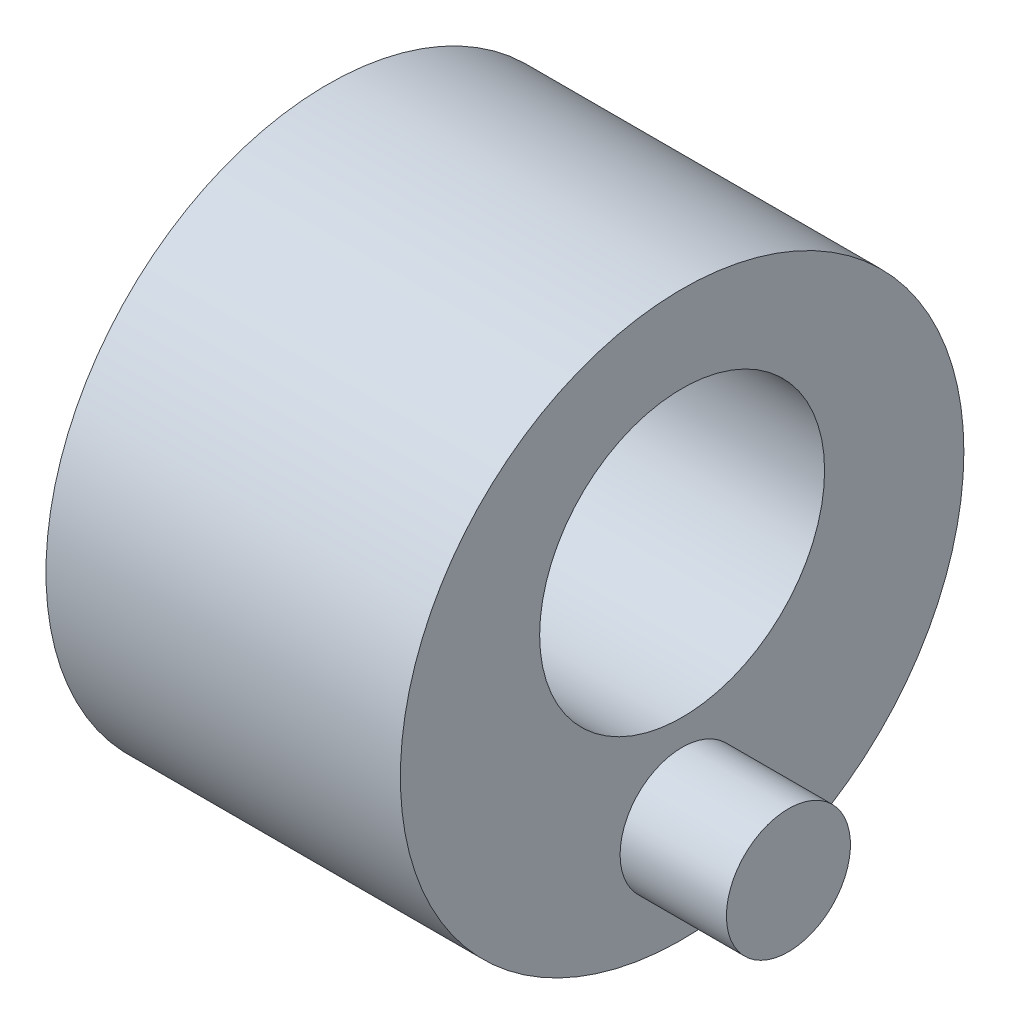
ISO-10303-21;
HEADER;
FILE_DESCRIPTION(('STEP AP214'),'2;1');
FILE_NAME('part.step','',(''),(''),'','','');
FILE_SCHEMA(('AUTOMOTIVE_DESIGN { 1 0 10303 214 1 1 1 1 }'));
ENDSEC;
DATA;
#1=APPLICATION_CONTEXT('core data for automotive mechanical design processes');
#2=APPLICATION_PROTOCOL_DEFINITION('international standard','automotive_design',2000,#1);
#3=PRODUCT_CONTEXT('',#1,'mechanical');
#4=PRODUCT('Part','Part','',(#3));
#5=PRODUCT_RELATED_PRODUCT_CATEGORY('part','',(#4));
#6=PRODUCT_DEFINITION_FORMATION('','',#4);
#7=PRODUCT_DEFINITION_CONTEXT('part definition',#1,'design');
#8=PRODUCT_DEFINITION('design','',#6,#7);
#9=PRODUCT_DEFINITION_SHAPE('','',#8);
#10=(LENGTH_UNIT() NAMED_UNIT(*) SI_UNIT(.MILLI.,.METRE.));
#11=(NAMED_UNIT(*) PLANE_ANGLE_UNIT() SI_UNIT($,.RADIAN.));
#12=(NAMED_UNIT(*) SI_UNIT($,.STERADIAN.) SOLID_ANGLE_UNIT());
#13=UNCERTAINTY_MEASURE_WITH_UNIT(LENGTH_MEASURE(1.E-05),#10,'distance_accuracy_value','');
#14=(GEOMETRIC_REPRESENTATION_CONTEXT(3) GLOBAL_UNCERTAINTY_ASSIGNED_CONTEXT((#13)) GLOBAL_UNIT_ASSIGNED_CONTEXT((#10,
#11,#12)) REPRESENTATION_CONTEXT('',''));
#15=CARTESIAN_POINT('',(0.,0.,0.));
#16=DIRECTION('',(0.,0.,1.));
#17=DIRECTION('',(1.,0.,0.));
#18=AXIS2_PLACEMENT_3D('',#15,#16,#17);
#19=CARTESIAN_POINT('',(-127.,0.,0.));
#20=DIRECTION('',(1.,0.,0.));
#21=DIRECTION('',(0.,0.,-1.));
#22=AXIS2_PLACEMENT_3D('',#19,#20,#21);
#23=CYLINDRICAL_SURFACE('',#22,100.965);
#24=CARTESIAN_POINT('',(-127.,0.,0.));
#25=DIRECTION('',(1.,0.,0.));
#26=DIRECTION('',(0.,0.,-1.));
#27=AXIS2_PLACEMENT_3D('',#24,#25,#26);
#28=CIRCLE('',#27,100.965);
#29=CARTESIAN_POINT('',(-127.,0.,-100.965));
#30=VERTEX_POINT('',#29);
#31=EDGE_CURVE('E10',#30,#30,#28,.T.);
#32=ORIENTED_EDGE('',*,*,#31,.T.);
#33=EDGE_LOOP('',(#32));
#34=FACE_BOUND('',#33,.T.);
#35=CARTESIAN_POINT('',(0.,0.,0.));
#36=DIRECTION('',(1.,0.,0.));
#37=DIRECTION('',(0.,0.,-1.));
#38=AXIS2_PLACEMENT_3D('',#35,#36,#37);
#39=CIRCLE('',#38,100.965);
#40=CARTESIAN_POINT('',(0.,0.,-100.965));
#41=VERTEX_POINT('',#40);
#42=EDGE_CURVE('E34',#41,#41,#39,.T.);
#43=ORIENTED_EDGE('',*,*,#42,.F.);
#44=EDGE_LOOP('',(#43));
#45=FACE_BOUND('',#44,.T.);
#46=ADVANCED_FACE('F31',(#34,#45),#23,.T.);
#47=CARTESIAN_POINT('',(-127.,0.,0.));
#48=DIRECTION('',(1.,0.,0.));
#49=DIRECTION('',(0.,0.,-1.));
#50=AXIS2_PLACEMENT_3D('',#47,#48,#49);
#51=PLANE('',#50);
#52=CARTESIAN_POINT('',(-127.,19.0499999999965,0.));
#53=DIRECTION('',(1.,0.,0.));
#54=DIRECTION('',(0.,0.,-1.));
#55=AXIS2_PLACEMENT_3D('',#52,#53,#54);
#56=CIRCLE('',#55,51.054);
#57=CARTESIAN_POINT('',(-127.,19.0499999999965,-51.054));
#58=VERTEX_POINT('',#57);
#59=EDGE_CURVE('E41',#58,#58,#56,.T.);
#60=ORIENTED_EDGE('',*,*,#59,.T.);
#61=EDGE_LOOP('',(#60));
#62=FACE_BOUND('',#61,.T.);
#63=ORIENTED_EDGE('',*,*,#31,.F.);
#64=EDGE_LOOP('',(#63));
#65=FACE_BOUND('',#64,.T.);
#66=ADVANCED_FACE('F67',(#62,#65),#51,.F.);
#67=CARTESIAN_POINT('',(0.,0.,0.));
#68=DIRECTION('',(1.,0.,0.));
#69=DIRECTION('',(0.,0.,-1.));
#70=AXIS2_PLACEMENT_3D('',#67,#68,#69);
#71=PLANE('',#70);
#72=CARTESIAN_POINT('',(0.,-63.5000000000024,-1.1085453250827E-13));
#73=DIRECTION('',(1.,0.,0.));
#74=DIRECTION('',(0.,0.,-1.));
#75=AXIS2_PLACEMENT_3D('',#72,#73,#74);
#76=CIRCLE('',#75,22.225);
#77=CARTESIAN_POINT('',(0.,-63.5000000000024,22.2249999999999));
#78=VERTEX_POINT('',#77);
#79=EDGE_CURVE('E49',#78,#78,#76,.T.);
#80=ORIENTED_EDGE('',*,*,#79,.F.);
#81=EDGE_LOOP('',(#80));
#82=FACE_BOUND('',#81,.T.);
#83=CARTESIAN_POINT('',(0.,19.0499999999965,0.));
#84=DIRECTION('',(1.,0.,0.));
#85=DIRECTION('',(0.,0.,-1.));
#86=AXIS2_PLACEMENT_3D('',#83,#84,#85);
#87=CIRCLE('',#86,51.054);
#88=CARTESIAN_POINT('',(0.,19.0499999999965,-51.054));
#89=VERTEX_POINT('',#88);
#90=EDGE_CURVE('E43',#89,#89,#87,.T.);
#91=ORIENTED_EDGE('',*,*,#90,.F.);
#92=EDGE_LOOP('',(#91));
#93=FACE_BOUND('',#92,.T.);
#94=ORIENTED_EDGE('',*,*,#42,.T.);
#95=EDGE_LOOP('',(#94));
#96=FACE_BOUND('',#95,.T.);
#97=ADVANCED_FACE('F64',(#82,#93,#96),#71,.T.);
#98=CARTESIAN_POINT('',(-127.,19.0499999999965,0.));
#99=DIRECTION('',(1.,0.,0.));
#100=DIRECTION('',(0.,0.,-1.));
#101=AXIS2_PLACEMENT_3D('',#98,#99,#100);
#102=CYLINDRICAL_SURFACE('',#101,51.054);
#103=ORIENTED_EDGE('',*,*,#59,.F.);
#104=EDGE_LOOP('',(#103));
#105=FACE_BOUND('',#104,.T.);
#106=ORIENTED_EDGE('',*,*,#90,.T.);
#107=EDGE_LOOP('',(#106));
#108=FACE_BOUND('',#107,.T.);
#109=ADVANCED_FACE('F60',(#105,#108),#102,.F.);
#110=CARTESIAN_POINT('',(38.1,-63.5000000000024,-1.1085453250827E-13));
#111=DIRECTION('',(-1.,0.,0.));
#112=DIRECTION('',(0.,0.,1.));
#113=AXIS2_PLACEMENT_3D('',#110,#111,#112);
#114=CYLINDRICAL_SURFACE('',#113,22.225);
#115=CARTESIAN_POINT('',(38.1,-63.5000000000024,-1.1085453250827E-13));
#116=DIRECTION('',(1.,0.,0.));
#117=DIRECTION('',(0.,0.,-1.));
#118=AXIS2_PLACEMENT_3D('',#115,#116,#117);
#119=CIRCLE('',#118,22.225);
#120=CARTESIAN_POINT('',(38.1,-63.5000000000024,22.2249999999999));
#121=VERTEX_POINT('',#120);
#122=EDGE_CURVE('E46',#121,#121,#119,.T.);
#123=CARTESIAN_POINT('',(38.1,-63.5000000000024,22.2249999999999));
#124=CARTESIAN_POINT('',(37.703125,-63.5000000000024,22.2249999999999));
#125=CARTESIAN_POINT('',(37.30625,-63.5000000000024,22.2249999999999));
#126=CARTESIAN_POINT('',(36.5125,-63.5000000000024,22.2249999999999));
#127=CARTESIAN_POINT('',(36.115625,-63.5000000000024,22.2249999999999));
#128=CARTESIAN_POINT('',(35.321875,-63.5000000000024,22.2249999999999));
#129=CARTESIAN_POINT('',(34.925,-63.5000000000024,22.2249999999999));
#130=CARTESIAN_POINT('',(34.13125,-63.5000000000024,22.2249999999999));
#131=CARTESIAN_POINT('',(33.734375,-63.5000000000024,22.2249999999999));
#132=CARTESIAN_POINT('',(32.940625,-63.5000000000024,22.2249999999999));
#133=CARTESIAN_POINT('',(32.54375,-63.5000000000024,22.2249999999999));
#134=CARTESIAN_POINT('',(31.75,-63.5000000000024,22.2249999999999));
#135=CARTESIAN_POINT('',(31.353125,-63.5000000000024,22.2249999999999));
#136=CARTESIAN_POINT('',(30.559375,-63.5000000000024,22.2249999999999));
#137=CARTESIAN_POINT('',(30.1625,-63.5000000000024,22.2249999999999));
#138=CARTESIAN_POINT('',(29.36875,-63.5000000000024,22.2249999999999));
#139=CARTESIAN_POINT('',(28.971875,-63.5000000000024,22.2249999999999));
#140=CARTESIAN_POINT('',(28.178125,-63.5000000000024,22.2249999999999));
#141=CARTESIAN_POINT('',(27.78125,-63.5000000000024,22.2249999999999));
#142=CARTESIAN_POINT('',(26.9875,-63.5000000000024,22.2249999999999));
#143=CARTESIAN_POINT('',(26.590625,-63.5000000000024,22.2249999999999));
#144=CARTESIAN_POINT('',(25.796875,-63.5000000000024,22.2249999999999));
#145=CARTESIAN_POINT('',(25.4,-63.5000000000024,22.2249999999999));
#146=CARTESIAN_POINT('',(24.60625,-63.5000000000024,22.2249999999999));
#147=CARTESIAN_POINT('',(24.209375,-63.5000000000024,22.2249999999999));
#148=CARTESIAN_POINT('',(23.415625,-63.5000000000024,22.2249999999999));
#149=CARTESIAN_POINT('',(23.01875,-63.5000000000024,22.2249999999999));
#150=CARTESIAN_POINT('',(22.225,-63.5000000000024,22.2249999999999));
#151=CARTESIAN_POINT('',(21.828125,-63.5000000000024,22.2249999999999));
#152=CARTESIAN_POINT('',(21.034375,-63.5000000000024,22.2249999999999));
#153=CARTESIAN_POINT('',(20.6375,-63.5000000000024,22.2249999999999));
#154=CARTESIAN_POINT('',(19.84375,-63.5000000000024,22.2249999999999));
#155=CARTESIAN_POINT('',(19.446875,-63.5000000000024,22.2249999999999));
#156=CARTESIAN_POINT('',(18.653125,-63.5000000000024,22.2249999999999));
#157=CARTESIAN_POINT('',(18.25625,-63.5000000000024,22.2249999999999));
#158=CARTESIAN_POINT('',(17.4625,-63.5000000000024,22.2249999999999));
#159=CARTESIAN_POINT('',(17.065625,-63.5000000000024,22.2249999999999));
#160=CARTESIAN_POINT('',(16.271875,-63.5000000000024,22.2249999999999));
#161=CARTESIAN_POINT('',(15.875,-63.5000000000024,22.2249999999999));
#162=CARTESIAN_POINT('',(15.08125,-63.5000000000024,22.2249999999999));
#163=CARTESIAN_POINT('',(14.684375,-63.5000000000024,22.2249999999999));
#164=CARTESIAN_POINT('',(13.890625,-63.5000000000024,22.2249999999999));
#165=CARTESIAN_POINT('',(13.49375,-63.5000000000024,22.2249999999999));
#166=CARTESIAN_POINT('',(12.7,-63.5000000000024,22.2249999999999));
#167=CARTESIAN_POINT('',(12.303125,-63.5000000000024,22.2249999999999));
#168=CARTESIAN_POINT('',(11.509375,-63.5000000000024,22.2249999999999));
#169=CARTESIAN_POINT('',(11.1125,-63.5000000000024,22.2249999999999));
#170=CARTESIAN_POINT('',(10.31875,-63.5000000000024,22.2249999999999));
#171=CARTESIAN_POINT('',(9.92187499999999,-63.5000000000024,22.2249999999999));
#172=CARTESIAN_POINT('',(9.128125,-63.5000000000024,22.2249999999999));
#173=CARTESIAN_POINT('',(8.73124999999999,-63.5000000000024,22.2249999999999));
#174=CARTESIAN_POINT('',(7.93749999999999,-63.5000000000024,22.2249999999999));
#175=CARTESIAN_POINT('',(7.54062499999999,-63.5000000000024,22.2249999999999));
#176=CARTESIAN_POINT('',(6.746875,-63.5000000000024,22.2249999999999));
#177=CARTESIAN_POINT('',(6.35,-63.5000000000024,22.2249999999999));
#178=CARTESIAN_POINT('',(5.55625,-63.5000000000024,22.2249999999999));
#179=CARTESIAN_POINT('',(5.159375,-63.5000000000024,22.2249999999999));
#180=CARTESIAN_POINT('',(4.365625,-63.5000000000024,22.2249999999999));
#181=CARTESIAN_POINT('',(3.96875,-63.5000000000024,22.2249999999999));
#182=CARTESIAN_POINT('',(3.175,-63.5000000000024,22.2249999999999));
#183=CARTESIAN_POINT('',(2.778125,-63.5000000000024,22.2249999999999));
#184=CARTESIAN_POINT('',(1.984375,-63.5000000000024,22.2249999999999));
#185=CARTESIAN_POINT('',(1.5875,-63.5000000000024,22.2249999999999));
#186=CARTESIAN_POINT('',(0.79375,-63.5000000000024,22.2249999999999));
#187=CARTESIAN_POINT('',(0.396875,-63.5000000000024,22.2249999999999));
#188=CARTESIAN_POINT('',(0.,-63.5000000000024,22.2249999999999));
#189=B_SPLINE_CURVE_WITH_KNOTS('',3,(#123,#124,#125,#126,#127,#128,#129,#130,#131,#132,#133,
#134,#135,#136,#137,#138,#139,#140,#141,#142,#143,#144,#145,#146,#147,#148,#149,#150,#151,#152,
#153,#154,#155,#156,#157,#158,#159,#160,#161,#162,#163,#164,#165,#166,#167,#168,#169,#170,#171,
#172,#173,#174,#175,#176,#177,#178,#179,#180,#181,#182,#183,#184,#185,#186,#187,#188),
.UNSPECIFIED.,.F.,.F.,(4,2,2,2,2,2,2,2,2,2,2,2,2,2,2,2,2,2,2,2,2,2,2,2,2,2,2,2,2,2,2,2,4),(0.,
1.190625,2.38125,3.571875,4.7625,5.953125,7.14375,8.334375,9.52500000000001,10.715625,11.90625,
13.096875,14.2875,15.478125,16.66875,17.859375,19.05,20.240625,21.43125,22.621875,23.8125,
25.003125,26.19375,27.384375,28.575,29.765625,30.95625,32.146875,33.3375,34.528125,35.71875,
36.909375,38.1),.UNSPECIFIED.);
#190=EDGE_CURVE('BSEAM57',#121,#78,#189,.T.);
#191=ORIENTED_EDGE('',*,*,#122,.F.);
#192=ORIENTED_EDGE('',*,*,#79,.T.);
#193=ORIENTED_EDGE('',*,*,#190,.T.);
#194=ORIENTED_EDGE('',*,*,#190,.F.);
#195=EDGE_LOOP('',(#191,#193,#192,#194));
#196=FACE_BOUND('',#195,.T.);
#197=ADVANCED_FACE('F57',(#196),#114,.T.);
#198=CARTESIAN_POINT('',(38.1,-63.5000000000024,-1.1085453250827E-13));
#199=DIRECTION('',(1.,0.,0.));
#200=DIRECTION('',(0.,0.,-1.));
#201=AXIS2_PLACEMENT_3D('',#198,#199,#200);
#202=PLANE('',#201);
#203=ORIENTED_EDGE('',*,*,#122,.T.);
#204=EDGE_LOOP('',(#203));
#205=FACE_BOUND('',#204,.T.);
#206=ADVANCED_FACE('F55',(#205),#202,.T.);
#207=CLOSED_SHELL('',(#46,#66,#97,#109,#197,#206));
#208=MANIFOLD_SOLID_BREP('B2',#207);
#209=ADVANCED_BREP_SHAPE_REPRESENTATION('',(#18,#208),#14);
#210=SHAPE_DEFINITION_REPRESENTATION(#9,#209);
ENDSEC;
END-ISO-10303-21;
